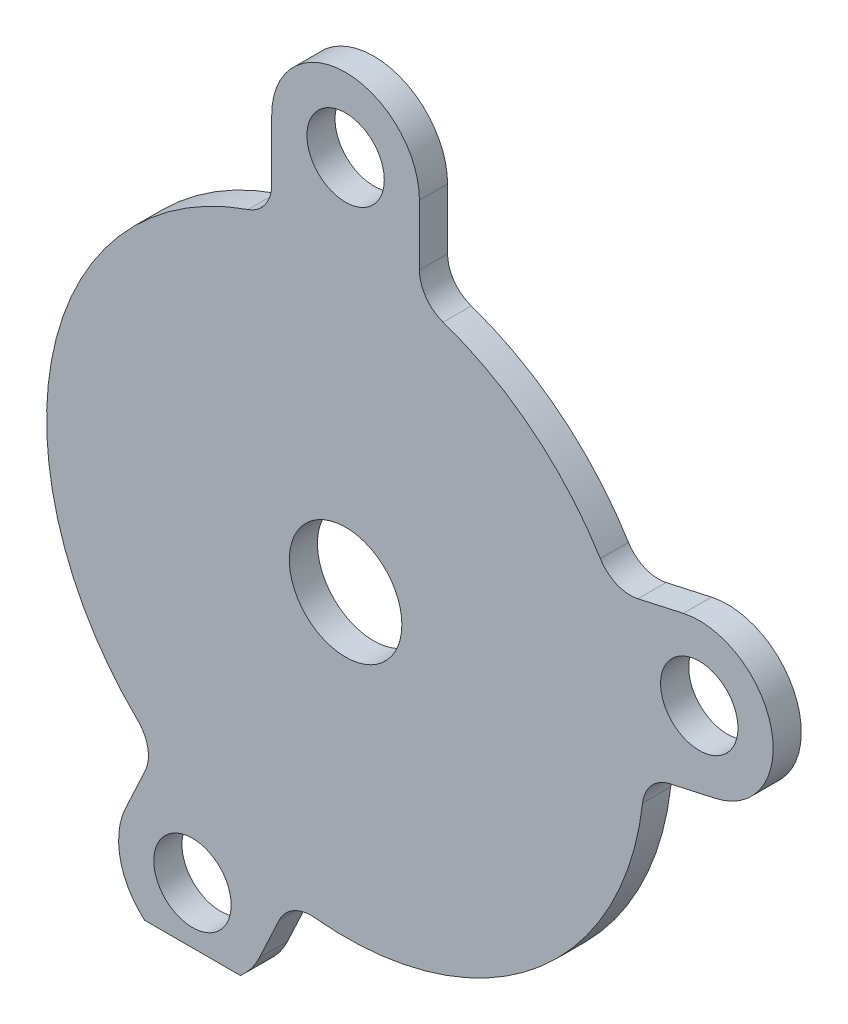
ISO-10303-21;
HEADER;
FILE_DESCRIPTION(('STEP AP214'),'2;1');
FILE_NAME('part.step','',(''),(''),'','','');
FILE_SCHEMA(('AUTOMOTIVE_DESIGN { 1 0 10303 214 1 1 1 1 }'));
ENDSEC;
DATA;
#1=APPLICATION_CONTEXT('core data for automotive mechanical design processes');
#2=APPLICATION_PROTOCOL_DEFINITION('international standard','automotive_design',2000,#1);
#3=PRODUCT_CONTEXT('',#1,'mechanical');
#4=PRODUCT('Part','Part','',(#3));
#5=PRODUCT_RELATED_PRODUCT_CATEGORY('part','',(#4));
#6=PRODUCT_DEFINITION_FORMATION('','',#4);
#7=PRODUCT_DEFINITION_CONTEXT('part definition',#1,'design');
#8=PRODUCT_DEFINITION('design','',#6,#7);
#9=PRODUCT_DEFINITION_SHAPE('','',#8);
#10=(LENGTH_UNIT() NAMED_UNIT(*) SI_UNIT(.MILLI.,.METRE.));
#11=(NAMED_UNIT(*) PLANE_ANGLE_UNIT() SI_UNIT($,.RADIAN.));
#12=(NAMED_UNIT(*) SI_UNIT($,.STERADIAN.) SOLID_ANGLE_UNIT());
#13=UNCERTAINTY_MEASURE_WITH_UNIT(LENGTH_MEASURE(1.E-05),#10,'distance_accuracy_value','');
#14=(GEOMETRIC_REPRESENTATION_CONTEXT(3) GLOBAL_UNCERTAINTY_ASSIGNED_CONTEXT((#13)) GLOBAL_UNIT_ASSIGNED_CONTEXT((#10,
#11,#12)) REPRESENTATION_CONTEXT('',''));
#15=CARTESIAN_POINT('',(0.,0.,0.));
#16=DIRECTION('',(0.,0.,1.));
#17=DIRECTION('',(1.,0.,0.));
#18=AXIS2_PLACEMENT_3D('',#15,#16,#17);
#19=CARTESIAN_POINT('',(47.190396016659,-5.41447354697508,4.));
#20=DIRECTION('',(0.,0.,1.));
#21=DIRECTION('',(1.,0.,0.));
#22=AXIS2_PLACEMENT_3D('',#19,#20,#21);
#23=PLANE('',#22);
#24=CARTESIAN_POINT('',(-21.7648404796457,-46.6748510323876,4.));
#25=DIRECTION('',(0.,0.,1.));
#26=DIRECTION('',(1.,0.,0.));
#27=AXIS2_PLACEMENT_3D('',#24,#25,#26);
#28=CIRCLE('',#27,5.5);
#29=CARTESIAN_POINT('',(-16.2648404796457,-46.6748510323876,4.));
#30=VERTEX_POINT('',#29);
#31=EDGE_CURVE('E394',#30,#30,#28,.T.);
#32=ORIENTED_EDGE('',*,*,#31,.F.);
#33=EDGE_LOOP('',(#32));
#34=FACE_BOUND('',#33,.T.);
#35=CARTESIAN_POINT('',(50.2792443666766,11.1466401178121,4.));
#36=DIRECTION('',(0.,0.,1.));
#37=DIRECTION('',(1.,0.,0.));
#38=AXIS2_PLACEMENT_3D('',#35,#36,#37);
#39=CIRCLE('',#38,5.5);
#40=CARTESIAN_POINT('',(55.7792443666766,11.1466401178121,4.));
#41=VERTEX_POINT('',#40);
#42=EDGE_CURVE('E204',#41,#41,#39,.T.);
#43=ORIENTED_EDGE('',*,*,#42,.F.);
#44=EDGE_LOOP('',(#43));
#45=FACE_BOUND('',#44,.T.);
#46=CARTESIAN_POINT('',(47.190396016659,-5.41447354697508,4.));
#47=DIRECTION('',(0.,0.,-1.));
#48=DIRECTION('',(1.,0.,0.));
#49=AXIS2_PLACEMENT_3D('',#46,#47,#48);
#50=CIRCLE('',#49,5.);
#51=CARTESIAN_POINT('',(42.2229859096423,-4.84452896308298,4.));
#52=VERTEX_POINT('',#51);
#53=CARTESIAN_POINT('',(46.1081979469685,-0.53299351137541,4.));
#54=VERTEX_POINT('',#53);
#55=EDGE_CURVE('E239',#52,#54,#50,.T.);
#56=ORIENTED_EDGE('',*,*,#55,.T.);
#57=DIRECTION('',(0.976296007119934,0.2164396139381,0.));
#58=VECTOR('',#57,1.);
#59=CARTESIAN_POINT('',(46.1081979469685,-0.53299351137541,4.));
#60=LINE('',#59,#58);
#61=CARTESIAN_POINT('',(52.5518603130267,0.895532043052833,4.));
#62=VERTEX_POINT('',#61);
#63=EDGE_CURVE('E127',#54,#62,#60,.T.);
#64=ORIENTED_EDGE('',*,*,#63,.T.);
#65=CARTESIAN_POINT('',(50.2792443666766,11.1466401178121,4.));
#66=DIRECTION('',(0.,0.,1.));
#67=DIRECTION('',(1.,0.,0.));
#68=AXIS2_PLACEMENT_3D('',#65,#66,#67);
#69=CIRCLE('',#68,10.5);
#70=CARTESIAN_POINT('',(48.0066284203265,21.3977481925715,4.));
#71=VERTEX_POINT('',#70);
#72=EDGE_CURVE('E290',#62,#71,#69,.T.);
#73=ORIENTED_EDGE('',*,*,#72,.T.);
#74=DIRECTION('',(-0.976296007119934,-0.216439613938099,0.));
#75=VECTOR('',#74,1.);
#76=CARTESIAN_POINT('',(48.0066284203265,21.3977481925714,4.));
#77=LINE('',#76,#75);
#78=CARTESIAN_POINT('',(41.5629660542684,19.9692226381432,4.));
#79=VERTEX_POINT('',#78);
#80=EDGE_CURVE('E309',#71,#79,#77,.T.);
#81=ORIENTED_EDGE('',*,*,#80,.T.);
#82=CARTESIAN_POINT('',(40.4807679845779,24.8507026737429,4.));
#83=DIRECTION('',(0.,0.,-1.));
#84=DIRECTION('',(-1.,0.,0.));
#85=AXIS2_PLACEMENT_3D('',#82,#83,#84);
#86=CIRCLE('',#85,5.);
#87=CARTESIAN_POINT('',(36.2196345125171,22.2348392344015,4.));
#88=VERTEX_POINT('',#87);
#89=EDGE_CURVE('E306',#79,#88,#86,.T.);
#90=ORIENTED_EDGE('',*,*,#89,.T.);
#91=CARTESIAN_POINT('',(0.,0.,4.));
#92=DIRECTION('',(0.,0.,1.));
#93=DIRECTION('',(1.,0.,0.));
#94=AXIS2_PLACEMENT_3D('',#91,#92,#93);
#95=CIRCLE('',#94,42.5);
#96=CARTESIAN_POINT('',(13.8684210526316,40.1735845737834,4.));
#97=VERTEX_POINT('',#96);
#98=EDGE_CURVE('E308',#88,#97,#95,.T.);
#99=ORIENTED_EDGE('',*,*,#98,.T.);
#100=CARTESIAN_POINT('',(15.5,44.8998886412873,4.));
#101=DIRECTION('',(0.,0.,-1.));
#102=DIRECTION('',(1.,0.,0.));
#103=AXIS2_PLACEMENT_3D('',#100,#101,#102);
#104=CIRCLE('',#103,5.);
#105=CARTESIAN_POINT('',(10.5,44.8998886412873,4.));
#106=VERTEX_POINT('',#105);
#107=EDGE_CURVE('E311',#97,#106,#104,.T.);
#108=ORIENTED_EDGE('',*,*,#107,.T.);
#109=DIRECTION('',(0.,1.,0.));
#110=VECTOR('',#109,1.);
#111=CARTESIAN_POINT('',(10.5,53.5,4.));
#112=LINE('',#111,#110);
#113=CARTESIAN_POINT('',(10.5,53.5,4.));
#114=VERTEX_POINT('',#113);
#115=EDGE_CURVE('E317',#106,#114,#112,.T.);
#116=ORIENTED_EDGE('',*,*,#115,.T.);
#117=CARTESIAN_POINT('',(0.,53.5,4.));
#118=DIRECTION('',(0.,0.,1.));
#119=DIRECTION('',(1.,0.,0.));
#120=AXIS2_PLACEMENT_3D('',#117,#118,#119);
#121=CIRCLE('',#120,10.5);
#122=CARTESIAN_POINT('',(-10.5,53.5,4.));
#123=VERTEX_POINT('',#122);
#124=EDGE_CURVE('E319',#114,#123,#121,.T.);
#125=ORIENTED_EDGE('',*,*,#124,.T.);
#126=DIRECTION('',(0.,-1.,0.));
#127=VECTOR('',#126,1.);
#128=CARTESIAN_POINT('',(-10.5,53.5,4.));
#129=LINE('',#128,#127);
#130=CARTESIAN_POINT('',(-10.5,44.8998886412873,4.));
#131=VERTEX_POINT('',#130);
#132=EDGE_CURVE('E321',#123,#131,#129,.T.);
#133=ORIENTED_EDGE('',*,*,#132,.T.);
#134=CARTESIAN_POINT('',(-15.5,44.8998886412873,4.));
#135=DIRECTION('',(0.,0.,-1.));
#136=DIRECTION('',(-1.,0.,0.));
#137=AXIS2_PLACEMENT_3D('',#134,#135,#136);
#138=CIRCLE('',#137,5.);
#139=CARTESIAN_POINT('',(-13.8684210526316,40.1735845737834,4.));
#140=VERTEX_POINT('',#139);
#141=EDGE_CURVE('E323',#131,#140,#138,.T.);
#142=ORIENTED_EDGE('',*,*,#141,.T.);
#143=CARTESIAN_POINT('',(0.,0.,4.));
#144=DIRECTION('',(0.,0.,1.));
#145=DIRECTION('',(1.,0.,0.));
#146=AXIS2_PLACEMENT_3D('',#143,#144,#145);
#147=CIRCLE('',#146,42.5);
#148=CARTESIAN_POINT('',(-29.5471484743681,-30.5485845340442,4.));
#149=VERTEX_POINT('',#148);
#150=EDGE_CURVE('E325',#140,#149,#147,.T.);
#151=ORIENTED_EDGE('',*,*,#150,.T.);
#152=CARTESIAN_POINT('',(-33.0232835889997,-34.1425356556965,4.));
#153=DIRECTION('',(0.,0.,-1.));
#154=DIRECTION('',(1.,0.,0.));
#155=AXIS2_PLACEMENT_3D('',#152,#153,#154);
#156=CIRCLE('',#155,5.00000000000001);
#157=CARTESIAN_POINT('',(-28.4917446538164,-36.2556269643999,4.));
#158=VERTEX_POINT('',#157);
#159=EDGE_CURVE('E327',#149,#158,#156,.T.);
#160=ORIENTED_EDGE('',*,*,#159,.T.);
#161=DIRECTION('',(-0.422618261740694,-0.906307787036653,0.));
#162=VECTOR('',#161,1.);
#163=CARTESIAN_POINT('',(-31.2810722435306,-42.2373592841103,4.));
#164=LINE('',#163,#162);
#165=CARTESIAN_POINT('',(-31.2810722435306,-42.2373592841103,4.));
#166=VERTEX_POINT('',#165);
#167=EDGE_CURVE('E329',#158,#166,#164,.T.);
#168=ORIENTED_EDGE('',*,*,#167,.T.);
#169=CARTESIAN_POINT('',(-21.7648404796457,-46.6748510323876,4.));
#170=DIRECTION('',(0.,0.,1.));
#171=DIRECTION('',(1.,0.,0.));
#172=AXIS2_PLACEMENT_3D('',#169,#170,#171);
#173=CIRCLE('',#172,10.5);
#174=CARTESIAN_POINT('',(-28.5655757340134,-54.6748510323876,4.));
#175=VERTEX_POINT('',#174);
#176=EDGE_CURVE('E331',#166,#175,#173,.T.);
#177=ORIENTED_EDGE('',*,*,#176,.T.);
#178=DIRECTION('',(1.,0.,0.));
#179=VECTOR('',#178,1.);
#180=CARTESIAN_POINT('',(-28.5655757340134,-54.6748510323876,4.));
#181=LINE('',#180,#179);
#182=CARTESIAN_POINT('',(-14.964105225278,-54.6748510323876,4.));
#183=VERTEX_POINT('',#182);
#184=EDGE_CURVE('E333',#175,#183,#181,.T.);
#185=ORIENTED_EDGE('',*,*,#184,.T.);
#186=CARTESIAN_POINT('',(-21.7648404796457,-46.6748510323876,4.));
#187=DIRECTION('',(0.,0.,1.));
#188=DIRECTION('',(1.,0.,0.));
#189=AXIS2_PLACEMENT_3D('',#186,#187,#188);
#190=CIRCLE('',#189,10.5);
#191=CARTESIAN_POINT('',(-12.2486087157609,-51.1123427806649,4.));
#192=VERTEX_POINT('',#191);
#193=EDGE_CURVE('E182',#183,#192,#190,.T.);
#194=ORIENTED_EDGE('',*,*,#193,.T.);
#195=DIRECTION('',(0.422618261740694,0.906307787036653,0.));
#196=VECTOR('',#195,1.);
#197=CARTESIAN_POINT('',(-12.2486087157609,-51.1123427806649,4.));
#198=LINE('',#197,#196);
#199=CARTESIAN_POINT('',(-9.45928112604669,-45.1306104609545,4.));
#200=VERTEX_POINT('',#199);
#201=EDGE_CURVE('E176',#192,#200,#198,.T.);
#202=ORIENTED_EDGE('',*,*,#201,.T.);
#203=CARTESIAN_POINT('',(-4.92774219086344,-47.243701769658,4.));
#204=DIRECTION('',(0.,0.,-1.));
#205=DIRECTION('',(-1.,0.,0.));
#206=AXIS2_PLACEMENT_3D('',#203,#204,#205);
#207=CIRCLE('',#206,5.);
#208=CARTESIAN_POINT('',(-4.40903248656202,-42.2706805307466,4.));
#209=VERTEX_POINT('',#208);
#210=EDGE_CURVE('E180',#200,#209,#207,.T.);
#211=ORIENTED_EDGE('',*,*,#210,.T.);
#212=CARTESIAN_POINT('',(0.,0.,4.));
#213=DIRECTION('',(0.,0.,1.));
#214=DIRECTION('',(1.,0.,0.));
#215=AXIS2_PLACEMENT_3D('',#212,#213,#214);
#216=CIRCLE('',#215,42.5);
#217=EDGE_CURVE('E48',#209,#52,#216,.T.);
#218=ORIENTED_EDGE('',*,*,#217,.T.);
#219=EDGE_LOOP('',(#56,#64,#73,#81,#90,#99,#108,#116,#125,#133,#142,#151,#160,#168,#177,#185,
#194,#202,#211,#218));
#220=FACE_BOUND('',#219,.T.);
#221=CARTESIAN_POINT('',(0.,53.5,4.));
#222=DIRECTION('',(0.,0.,1.));
#223=DIRECTION('',(1.,0.,0.));
#224=AXIS2_PLACEMENT_3D('',#221,#222,#223);
#225=CIRCLE('',#224,5.5);
#226=CARTESIAN_POINT('',(5.5,53.5,4.));
#227=VERTEX_POINT('',#226);
#228=EDGE_CURVE('E400',#227,#227,#225,.T.);
#229=ORIENTED_EDGE('',*,*,#228,.F.);
#230=EDGE_LOOP('',(#229));
#231=FACE_BOUND('',#230,.T.);
#232=CARTESIAN_POINT('',(0.,0.,4.));
#233=DIRECTION('',(0.,0.,1.));
#234=DIRECTION('',(1.,0.,0.));
#235=AXIS2_PLACEMENT_3D('',#232,#233,#234);
#236=CIRCLE('',#235,8.);
#237=CARTESIAN_POINT('',(8.,0.,4.));
#238=VERTEX_POINT('',#237);
#239=EDGE_CURVE('E385',#238,#238,#236,.T.);
#240=ORIENTED_EDGE('',*,*,#239,.F.);
#241=EDGE_LOOP('',(#240));
#242=FACE_BOUND('',#241,.T.);
#243=ADVANCED_FACE('F31',(#34,#45,#220,#231,#242),#23,.T.);
#244=CARTESIAN_POINT('',(47.190396016659,-5.41447354697508,0.));
#245=DIRECTION('',(0.,0.,1.));
#246=DIRECTION('',(1.,0.,0.));
#247=AXIS2_PLACEMENT_3D('',#244,#245,#246);
#248=PLANE('',#247);
#249=CARTESIAN_POINT('',(-21.7648404796457,-46.6748510323876,0.));
#250=DIRECTION('',(0.,0.,1.));
#251=DIRECTION('',(1.,0.,0.));
#252=AXIS2_PLACEMENT_3D('',#249,#250,#251);
#253=CIRCLE('',#252,5.5);
#254=CARTESIAN_POINT('',(-16.2648404796457,-46.6748510323876,0.));
#255=VERTEX_POINT('',#254);
#256=EDGE_CURVE('E391',#255,#255,#253,.T.);
#257=ORIENTED_EDGE('',*,*,#256,.T.);
#258=EDGE_LOOP('',(#257));
#259=FACE_BOUND('',#258,.T.);
#260=CARTESIAN_POINT('',(50.2792443666766,11.1466401178121,0.));
#261=DIRECTION('',(0.,0.,1.));
#262=DIRECTION('',(1.,0.,0.));
#263=AXIS2_PLACEMENT_3D('',#260,#261,#262);
#264=CIRCLE('',#263,5.5);
#265=CARTESIAN_POINT('',(55.7792443666766,11.1466401178121,0.));
#266=VERTEX_POINT('',#265);
#267=EDGE_CURVE('E403',#266,#266,#264,.T.);
#268=ORIENTED_EDGE('',*,*,#267,.T.);
#269=EDGE_LOOP('',(#268));
#270=FACE_BOUND('',#269,.T.);
#271=CARTESIAN_POINT('',(47.190396016659,-5.41447354697508,0.));
#272=DIRECTION('',(0.,0.,-1.));
#273=DIRECTION('',(1.,0.,0.));
#274=AXIS2_PLACEMENT_3D('',#271,#272,#273);
#275=CIRCLE('',#274,5.);
#276=CARTESIAN_POINT('',(42.2229859096423,-4.84452896308298,0.));
#277=VERTEX_POINT('',#276);
#278=CARTESIAN_POINT('',(46.1081979469685,-0.53299351137541,0.));
#279=VERTEX_POINT('',#278);
#280=EDGE_CURVE('E200',#277,#279,#275,.T.);
#281=ORIENTED_EDGE('',*,*,#280,.F.);
#282=CARTESIAN_POINT('',(0.,0.,0.));
#283=DIRECTION('',(0.,0.,1.));
#284=DIRECTION('',(1.,0.,0.));
#285=AXIS2_PLACEMENT_3D('',#282,#283,#284);
#286=CIRCLE('',#285,42.5);
#287=CARTESIAN_POINT('',(-4.40903248656202,-42.2706805307466,0.));
#288=VERTEX_POINT('',#287);
#289=EDGE_CURVE('E119',#288,#277,#286,.T.);
#290=ORIENTED_EDGE('',*,*,#289,.F.);
#291=CARTESIAN_POINT('',(-4.92774219086344,-47.243701769658,0.));
#292=DIRECTION('',(0.,0.,-1.));
#293=DIRECTION('',(-1.,0.,0.));
#294=AXIS2_PLACEMENT_3D('',#291,#292,#293);
#295=CIRCLE('',#294,5.);
#296=CARTESIAN_POINT('',(-9.45928112604669,-45.1306104609545,0.));
#297=VERTEX_POINT('',#296);
#298=EDGE_CURVE('E113',#297,#288,#295,.T.);
#299=ORIENTED_EDGE('',*,*,#298,.F.);
#300=DIRECTION('',(0.422618261740694,0.906307787036653,0.));
#301=VECTOR('',#300,1.);
#302=CARTESIAN_POINT('',(-12.2486087157609,-51.1123427806649,0.));
#303=LINE('',#302,#301);
#304=CARTESIAN_POINT('',(-12.2486087157609,-51.1123427806649,0.));
#305=VERTEX_POINT('',#304);
#306=EDGE_CURVE('E190',#305,#297,#303,.T.);
#307=ORIENTED_EDGE('',*,*,#306,.F.);
#308=CARTESIAN_POINT('',(-21.7648404796457,-46.6748510323876,0.));
#309=DIRECTION('',(0.,0.,1.));
#310=DIRECTION('',(1.,0.,0.));
#311=AXIS2_PLACEMENT_3D('',#308,#309,#310);
#312=CIRCLE('',#311,10.5);
#313=CARTESIAN_POINT('',(-14.964105225278,-54.6748510323876,0.));
#314=VERTEX_POINT('',#313);
#315=EDGE_CURVE('E234',#314,#305,#312,.T.);
#316=ORIENTED_EDGE('',*,*,#315,.F.);
#317=DIRECTION('',(1.,0.,0.));
#318=VECTOR('',#317,1.);
#319=CARTESIAN_POINT('',(-28.5655757340134,-54.6748510323876,0.));
#320=LINE('',#319,#318);
#321=CARTESIAN_POINT('',(-28.5655757340134,-54.6748510323876,0.));
#322=VERTEX_POINT('',#321);
#323=EDGE_CURVE('E232',#322,#314,#320,.T.);
#324=ORIENTED_EDGE('',*,*,#323,.F.);
#325=CARTESIAN_POINT('',(-21.7648404796457,-46.6748510323876,0.));
#326=DIRECTION('',(0.,0.,1.));
#327=DIRECTION('',(1.,0.,0.));
#328=AXIS2_PLACEMENT_3D('',#325,#326,#327);
#329=CIRCLE('',#328,10.5);
#330=CARTESIAN_POINT('',(-31.2810722435306,-42.2373592841103,0.));
#331=VERTEX_POINT('',#330);
#332=EDGE_CURVE('E230',#331,#322,#329,.T.);
#333=ORIENTED_EDGE('',*,*,#332,.F.);
#334=DIRECTION('',(-0.422618261740694,-0.906307787036653,0.));
#335=VECTOR('',#334,1.);
#336=CARTESIAN_POINT('',(-31.2810722435306,-42.2373592841103,0.));
#337=LINE('',#336,#335);
#338=CARTESIAN_POINT('',(-28.4917446538164,-36.2556269643999,0.));
#339=VERTEX_POINT('',#338);
#340=EDGE_CURVE('E228',#339,#331,#337,.T.);
#341=ORIENTED_EDGE('',*,*,#340,.F.);
#342=CARTESIAN_POINT('',(-33.0232835889997,-34.1425356556965,0.));
#343=DIRECTION('',(0.,0.,-1.));
#344=DIRECTION('',(1.,0.,0.));
#345=AXIS2_PLACEMENT_3D('',#342,#343,#344);
#346=CIRCLE('',#345,5.00000000000001);
#347=CARTESIAN_POINT('',(-29.5471484743681,-30.5485845340442,0.));
#348=VERTEX_POINT('',#347);
#349=EDGE_CURVE('E226',#348,#339,#346,.T.);
#350=ORIENTED_EDGE('',*,*,#349,.F.);
#351=CARTESIAN_POINT('',(0.,0.,0.));
#352=DIRECTION('',(0.,0.,1.));
#353=DIRECTION('',(1.,0.,0.));
#354=AXIS2_PLACEMENT_3D('',#351,#352,#353);
#355=CIRCLE('',#354,42.5);
#356=CARTESIAN_POINT('',(-13.8684210526316,40.1735845737834,0.));
#357=VERTEX_POINT('',#356);
#358=EDGE_CURVE('E224',#357,#348,#355,.T.);
#359=ORIENTED_EDGE('',*,*,#358,.F.);
#360=CARTESIAN_POINT('',(-15.5,44.8998886412873,0.));
#361=DIRECTION('',(0.,0.,-1.));
#362=DIRECTION('',(-1.,0.,0.));
#363=AXIS2_PLACEMENT_3D('',#360,#361,#362);
#364=CIRCLE('',#363,5.);
#365=CARTESIAN_POINT('',(-10.5,44.8998886412873,0.));
#366=VERTEX_POINT('',#365);
#367=EDGE_CURVE('E222',#366,#357,#364,.T.);
#368=ORIENTED_EDGE('',*,*,#367,.F.);
#369=DIRECTION('',(0.,-1.,0.));
#370=VECTOR('',#369,1.);
#371=CARTESIAN_POINT('',(-10.5,53.5,0.));
#372=LINE('',#371,#370);
#373=CARTESIAN_POINT('',(-10.5,53.5,0.));
#374=VERTEX_POINT('',#373);
#375=EDGE_CURVE('E220',#374,#366,#372,.T.);
#376=ORIENTED_EDGE('',*,*,#375,.F.);
#377=CARTESIAN_POINT('',(0.,53.5,0.));
#378=DIRECTION('',(0.,0.,1.));
#379=DIRECTION('',(1.,0.,0.));
#380=AXIS2_PLACEMENT_3D('',#377,#378,#379);
#381=CIRCLE('',#380,10.5);
#382=CARTESIAN_POINT('',(10.5,53.5,0.));
#383=VERTEX_POINT('',#382);
#384=EDGE_CURVE('E218',#383,#374,#381,.T.);
#385=ORIENTED_EDGE('',*,*,#384,.F.);
#386=DIRECTION('',(0.,1.,0.));
#387=VECTOR('',#386,1.);
#388=CARTESIAN_POINT('',(10.5,53.5,0.));
#389=LINE('',#388,#387);
#390=CARTESIAN_POINT('',(10.5,44.8998886412873,0.));
#391=VERTEX_POINT('',#390);
#392=EDGE_CURVE('E216',#391,#383,#389,.T.);
#393=ORIENTED_EDGE('',*,*,#392,.F.);
#394=CARTESIAN_POINT('',(15.5,44.8998886412873,0.));
#395=DIRECTION('',(0.,0.,-1.));
#396=DIRECTION('',(1.,0.,0.));
#397=AXIS2_PLACEMENT_3D('',#394,#395,#396);
#398=CIRCLE('',#397,5.);
#399=CARTESIAN_POINT('',(13.8684210526316,40.1735845737834,0.));
#400=VERTEX_POINT('',#399);
#401=EDGE_CURVE('E214',#400,#391,#398,.T.);
#402=ORIENTED_EDGE('',*,*,#401,.F.);
#403=CARTESIAN_POINT('',(0.,0.,0.));
#404=DIRECTION('',(0.,0.,1.));
#405=DIRECTION('',(1.,0.,0.));
#406=AXIS2_PLACEMENT_3D('',#403,#404,#405);
#407=CIRCLE('',#406,42.5);
#408=CARTESIAN_POINT('',(36.2196345125171,22.2348392344015,0.));
#409=VERTEX_POINT('',#408);
#410=EDGE_CURVE('E212',#409,#400,#407,.T.);
#411=ORIENTED_EDGE('',*,*,#410,.F.);
#412=CARTESIAN_POINT('',(40.4807679845779,24.8507026737429,0.));
#413=DIRECTION('',(0.,0.,-1.));
#414=DIRECTION('',(-1.,0.,0.));
#415=AXIS2_PLACEMENT_3D('',#412,#413,#414);
#416=CIRCLE('',#415,5.);
#417=CARTESIAN_POINT('',(41.5629660542684,19.9692226381432,0.));
#418=VERTEX_POINT('',#417);
#419=EDGE_CURVE('E210',#418,#409,#416,.T.);
#420=ORIENTED_EDGE('',*,*,#419,.F.);
#421=DIRECTION('',(-0.976296007119934,-0.216439613938099,0.));
#422=VECTOR('',#421,1.);
#423=CARTESIAN_POINT('',(48.0066284203265,21.3977481925714,0.));
#424=LINE('',#423,#422);
#425=CARTESIAN_POINT('',(48.0066284203265,21.3977481925715,0.));
#426=VERTEX_POINT('',#425);
#427=EDGE_CURVE('E208',#426,#418,#424,.T.);
#428=ORIENTED_EDGE('',*,*,#427,.F.);
#429=CARTESIAN_POINT('',(50.2792443666766,11.1466401178121,0.));
#430=DIRECTION('',(0.,0.,1.));
#431=DIRECTION('',(1.,0.,0.));
#432=AXIS2_PLACEMENT_3D('',#429,#430,#431);
#433=CIRCLE('',#432,10.5);
#434=CARTESIAN_POINT('',(52.5518603130267,0.895532043052833,0.));
#435=VERTEX_POINT('',#434);
#436=EDGE_CURVE('E206',#435,#426,#433,.T.);
#437=ORIENTED_EDGE('',*,*,#436,.F.);
#438=DIRECTION('',(0.976296007119934,0.2164396139381,0.));
#439=VECTOR('',#438,1.);
#440=CARTESIAN_POINT('',(46.1081979469685,-0.53299351137541,0.));
#441=LINE('',#440,#439);
#442=EDGE_CURVE('E203',#279,#435,#441,.T.);
#443=ORIENTED_EDGE('',*,*,#442,.F.);
#444=EDGE_LOOP('',(#281,#290,#299,#307,#316,#324,#333,#341,#350,#359,#368,#376,#385,#393,#402,
#411,#420,#428,#437,#443));
#445=FACE_BOUND('',#444,.T.);
#446=CARTESIAN_POINT('',(0.,53.5,0.));
#447=DIRECTION('',(0.,0.,1.));
#448=DIRECTION('',(1.,0.,0.));
#449=AXIS2_PLACEMENT_3D('',#446,#447,#448);
#450=CIRCLE('',#449,5.5);
#451=CARTESIAN_POINT('',(5.5,53.5,0.));
#452=VERTEX_POINT('',#451);
#453=EDGE_CURVE('E397',#452,#452,#450,.T.);
#454=ORIENTED_EDGE('',*,*,#453,.T.);
#455=EDGE_LOOP('',(#454));
#456=FACE_BOUND('',#455,.T.);
#457=CARTESIAN_POINT('',(0.,0.,0.));
#458=DIRECTION('',(0.,0.,1.));
#459=DIRECTION('',(1.,0.,0.));
#460=AXIS2_PLACEMENT_3D('',#457,#458,#459);
#461=CIRCLE('',#460,8.);
#462=CARTESIAN_POINT('',(8.,0.,0.));
#463=VERTEX_POINT('',#462);
#464=EDGE_CURVE('E388',#463,#463,#461,.T.);
#465=ORIENTED_EDGE('',*,*,#464,.T.);
#466=EDGE_LOOP('',(#465));
#467=FACE_BOUND('',#466,.T.);
#468=ADVANCED_FACE('F294',(#259,#270,#445,#456,#467),#248,.F.);
#469=CARTESIAN_POINT('',(47.190396016659,-5.41447354697508,4.));
#470=DIRECTION('',(0.,0.,-1.));
#471=DIRECTION('',(-1.,0.,0.));
#472=AXIS2_PLACEMENT_3D('',#469,#470,#471);
#473=CYLINDRICAL_SURFACE('',#472,5.);
#474=ORIENTED_EDGE('',*,*,#280,.T.);
#475=DIRECTION('',(0.,0.,-1.));
#476=VECTOR('',#475,1.);
#477=CARTESIAN_POINT('',(46.1081979469685,-0.53299351137541,4.));
#478=LINE('',#477,#476);
#479=EDGE_CURVE('E11',#54,#279,#478,.T.);
#480=ORIENTED_EDGE('',*,*,#479,.F.);
#481=ORIENTED_EDGE('',*,*,#55,.F.);
#482=DIRECTION('',(0.,0.,-1.));
#483=VECTOR('',#482,1.);
#484=CARTESIAN_POINT('',(42.2229859096423,-4.84452896308298,4.));
#485=LINE('',#484,#483);
#486=EDGE_CURVE('E196',#52,#277,#485,.T.);
#487=ORIENTED_EDGE('',*,*,#486,.T.);
#488=EDGE_LOOP('',(#474,#480,#481,#487));
#489=FACE_BOUND('',#488,.T.);
#490=ADVANCED_FACE('F33',(#489),#473,.F.);
#491=CARTESIAN_POINT('',(46.1081979469685,-0.53299351137541,4.));
#492=DIRECTION('',(-0.2164396139381,0.976296007119934,0.));
#493=DIRECTION('',(-0.976296007119934,-0.2164396139381,0.));
#494=AXIS2_PLACEMENT_3D('',#491,#492,#493);
#495=PLANE('',#494);
#496=ORIENTED_EDGE('',*,*,#442,.T.);
#497=DIRECTION('',(0.,0.,-1.));
#498=VECTOR('',#497,1.);
#499=CARTESIAN_POINT('',(52.5518603130267,0.895532043052833,4.));
#500=LINE('',#499,#498);
#501=EDGE_CURVE('E40',#62,#435,#500,.T.);
#502=ORIENTED_EDGE('',*,*,#501,.F.);
#503=ORIENTED_EDGE('',*,*,#63,.F.);
#504=ORIENTED_EDGE('',*,*,#479,.T.);
#505=EDGE_LOOP('',(#496,#502,#503,#504));
#506=FACE_BOUND('',#505,.T.);
#507=ADVANCED_FACE('F592',(#506),#495,.F.);
#508=CARTESIAN_POINT('',(50.2792443666766,11.1466401178121,4.));
#509=DIRECTION('',(0.,0.,-1.));
#510=DIRECTION('',(-1.,0.,0.));
#511=AXIS2_PLACEMENT_3D('',#508,#509,#510);
#512=CYLINDRICAL_SURFACE('',#511,10.5);
#513=ORIENTED_EDGE('',*,*,#436,.T.);
#514=DIRECTION('',(0.,0.,-1.));
#515=VECTOR('',#514,1.);
#516=CARTESIAN_POINT('',(48.0066284203265,21.3977481925715,4.));
#517=LINE('',#516,#515);
#518=EDGE_CURVE('E282',#71,#426,#517,.T.);
#519=ORIENTED_EDGE('',*,*,#518,.F.);
#520=ORIENTED_EDGE('',*,*,#72,.F.);
#521=ORIENTED_EDGE('',*,*,#501,.T.);
#522=EDGE_LOOP('',(#513,#519,#520,#521));
#523=FACE_BOUND('',#522,.T.);
#524=ADVANCED_FACE('F288',(#523),#512,.T.);
#525=CARTESIAN_POINT('',(48.0066284203265,21.3977481925714,4.));
#526=DIRECTION('',(0.216439613938099,-0.976296007119934,0.));
#527=DIRECTION('',(0.976296007119934,0.216439613938099,0.));
#528=AXIS2_PLACEMENT_3D('',#525,#526,#527);
#529=PLANE('',#528);
#530=ORIENTED_EDGE('',*,*,#427,.T.);
#531=DIRECTION('',(0.,0.,-1.));
#532=VECTOR('',#531,1.);
#533=CARTESIAN_POINT('',(41.5629660542684,19.9692226381432,4.));
#534=LINE('',#533,#532);
#535=EDGE_CURVE('E279',#79,#418,#534,.T.);
#536=ORIENTED_EDGE('',*,*,#535,.F.);
#537=ORIENTED_EDGE('',*,*,#80,.F.);
#538=ORIENTED_EDGE('',*,*,#518,.T.);
#539=EDGE_LOOP('',(#530,#536,#537,#538));
#540=FACE_BOUND('',#539,.T.);
#541=ADVANCED_FACE('F300',(#540),#529,.F.);
#542=CARTESIAN_POINT('',(40.4807679845779,24.8507026737429,4.));
#543=DIRECTION('',(0.,0.,-1.));
#544=DIRECTION('',(-1.,0.,0.));
#545=AXIS2_PLACEMENT_3D('',#542,#543,#544);
#546=CYLINDRICAL_SURFACE('',#545,5.);
#547=ORIENTED_EDGE('',*,*,#419,.T.);
#548=DIRECTION('',(0.,0.,-1.));
#549=VECTOR('',#548,1.);
#550=CARTESIAN_POINT('',(36.2196345125171,22.2348392344015,4.));
#551=LINE('',#550,#549);
#552=EDGE_CURVE('E276',#88,#409,#551,.T.);
#553=ORIENTED_EDGE('',*,*,#552,.F.);
#554=ORIENTED_EDGE('',*,*,#89,.F.);
#555=ORIENTED_EDGE('',*,*,#535,.T.);
#556=EDGE_LOOP('',(#547,#553,#554,#555));
#557=FACE_BOUND('',#556,.T.);
#558=ADVANCED_FACE('F304',(#557),#546,.F.);
#559=CARTESIAN_POINT('',(0.,0.,4.));
#560=DIRECTION('',(0.,0.,-1.));
#561=DIRECTION('',(-1.,0.,0.));
#562=AXIS2_PLACEMENT_3D('',#559,#560,#561);
#563=CYLINDRICAL_SURFACE('',#562,42.5);
#564=ORIENTED_EDGE('',*,*,#410,.T.);
#565=DIRECTION('',(0.,0.,-1.));
#566=VECTOR('',#565,1.);
#567=CARTESIAN_POINT('',(13.8684210526316,40.1735845737834,4.));
#568=LINE('',#567,#566);
#569=EDGE_CURVE('E273',#97,#400,#568,.T.);
#570=ORIENTED_EDGE('',*,*,#569,.F.);
#571=ORIENTED_EDGE('',*,*,#98,.F.);
#572=ORIENTED_EDGE('',*,*,#552,.T.);
#573=EDGE_LOOP('',(#564,#570,#571,#572));
#574=FACE_BOUND('',#573,.T.);
#575=ADVANCED_FACE('F557',(#574),#563,.T.);
#576=CARTESIAN_POINT('',(15.5,44.8998886412873,4.));
#577=DIRECTION('',(0.,0.,-1.));
#578=DIRECTION('',(-1.,0.,0.));
#579=AXIS2_PLACEMENT_3D('',#576,#577,#578);
#580=CYLINDRICAL_SURFACE('',#579,5.);
#581=ORIENTED_EDGE('',*,*,#401,.T.);
#582=DIRECTION('',(0.,0.,-1.));
#583=VECTOR('',#582,1.);
#584=CARTESIAN_POINT('',(10.5,44.8998886412873,4.));
#585=LINE('',#584,#583);
#586=EDGE_CURVE('E270',#106,#391,#585,.T.);
#587=ORIENTED_EDGE('',*,*,#586,.F.);
#588=ORIENTED_EDGE('',*,*,#107,.F.);
#589=ORIENTED_EDGE('',*,*,#569,.T.);
#590=EDGE_LOOP('',(#581,#587,#588,#589));
#591=FACE_BOUND('',#590,.T.);
#592=ADVANCED_FACE('F547',(#591),#580,.F.);
#593=CARTESIAN_POINT('',(10.5,53.5,4.));
#594=DIRECTION('',(-1.,0.,0.));
#595=DIRECTION('',(0.,0.,1.));
#596=AXIS2_PLACEMENT_3D('',#593,#594,#595);
#597=PLANE('',#596);
#598=ORIENTED_EDGE('',*,*,#392,.T.);
#599=DIRECTION('',(0.,0.,-1.));
#600=VECTOR('',#599,1.);
#601=CARTESIAN_POINT('',(10.5,53.5,4.));
#602=LINE('',#601,#600);
#603=EDGE_CURVE('E267',#114,#383,#602,.T.);
#604=ORIENTED_EDGE('',*,*,#603,.F.);
#605=ORIENTED_EDGE('',*,*,#115,.F.);
#606=ORIENTED_EDGE('',*,*,#586,.T.);
#607=EDGE_LOOP('',(#598,#604,#605,#606));
#608=FACE_BOUND('',#607,.T.);
#609=ADVANCED_FACE('F537',(#608),#597,.F.);
#610=CARTESIAN_POINT('',(0.,53.5,4.));
#611=DIRECTION('',(0.,0.,-1.));
#612=DIRECTION('',(-1.,0.,0.));
#613=AXIS2_PLACEMENT_3D('',#610,#611,#612);
#614=CYLINDRICAL_SURFACE('',#613,10.5);
#615=ORIENTED_EDGE('',*,*,#384,.T.);
#616=DIRECTION('',(0.,0.,-1.));
#617=VECTOR('',#616,1.);
#618=CARTESIAN_POINT('',(-10.5,53.5,4.));
#619=LINE('',#618,#617);
#620=EDGE_CURVE('E264',#123,#374,#619,.T.);
#621=ORIENTED_EDGE('',*,*,#620,.F.);
#622=ORIENTED_EDGE('',*,*,#124,.F.);
#623=ORIENTED_EDGE('',*,*,#603,.T.);
#624=EDGE_LOOP('',(#615,#621,#622,#623));
#625=FACE_BOUND('',#624,.T.);
#626=ADVANCED_FACE('F527',(#625),#614,.T.);
#627=CARTESIAN_POINT('',(-10.5,53.5,4.));
#628=DIRECTION('',(1.,0.,0.));
#629=DIRECTION('',(0.,0.,-1.));
#630=AXIS2_PLACEMENT_3D('',#627,#628,#629);
#631=PLANE('',#630);
#632=ORIENTED_EDGE('',*,*,#375,.T.);
#633=DIRECTION('',(0.,0.,-1.));
#634=VECTOR('',#633,1.);
#635=CARTESIAN_POINT('',(-10.5,44.8998886412873,4.));
#636=LINE('',#635,#634);
#637=EDGE_CURVE('E261',#131,#366,#636,.T.);
#638=ORIENTED_EDGE('',*,*,#637,.F.);
#639=ORIENTED_EDGE('',*,*,#132,.F.);
#640=ORIENTED_EDGE('',*,*,#620,.T.);
#641=EDGE_LOOP('',(#632,#638,#639,#640));
#642=FACE_BOUND('',#641,.T.);
#643=ADVANCED_FACE('F517',(#642),#631,.F.);
#644=CARTESIAN_POINT('',(-15.5,44.8998886412873,4.));
#645=DIRECTION('',(0.,0.,-1.));
#646=DIRECTION('',(-1.,0.,0.));
#647=AXIS2_PLACEMENT_3D('',#644,#645,#646);
#648=CYLINDRICAL_SURFACE('',#647,5.);
#649=ORIENTED_EDGE('',*,*,#367,.T.);
#650=DIRECTION('',(0.,0.,-1.));
#651=VECTOR('',#650,1.);
#652=CARTESIAN_POINT('',(-13.8684210526316,40.1735845737834,4.));
#653=LINE('',#652,#651);
#654=EDGE_CURVE('E258',#140,#357,#653,.T.);
#655=ORIENTED_EDGE('',*,*,#654,.F.);
#656=ORIENTED_EDGE('',*,*,#141,.F.);
#657=ORIENTED_EDGE('',*,*,#637,.T.);
#658=EDGE_LOOP('',(#649,#655,#656,#657));
#659=FACE_BOUND('',#658,.T.);
#660=ADVANCED_FACE('F507',(#659),#648,.F.);
#661=CARTESIAN_POINT('',(0.,0.,4.));
#662=DIRECTION('',(0.,0.,-1.));
#663=DIRECTION('',(-1.,0.,0.));
#664=AXIS2_PLACEMENT_3D('',#661,#662,#663);
#665=CYLINDRICAL_SURFACE('',#664,42.5);
#666=ORIENTED_EDGE('',*,*,#358,.T.);
#667=DIRECTION('',(0.,0.,-1.));
#668=VECTOR('',#667,1.);
#669=CARTESIAN_POINT('',(-29.5471484743681,-30.5485845340442,4.));
#670=LINE('',#669,#668);
#671=EDGE_CURVE('E255',#149,#348,#670,.T.);
#672=ORIENTED_EDGE('',*,*,#671,.F.);
#673=ORIENTED_EDGE('',*,*,#150,.F.);
#674=ORIENTED_EDGE('',*,*,#654,.T.);
#675=EDGE_LOOP('',(#666,#672,#673,#674));
#676=FACE_BOUND('',#675,.T.);
#677=ADVANCED_FACE('F497',(#676),#665,.T.);
#678=CARTESIAN_POINT('',(-33.0232835889997,-34.1425356556965,4.));
#679=DIRECTION('',(0.,0.,-1.));
#680=DIRECTION('',(-1.,0.,0.));
#681=AXIS2_PLACEMENT_3D('',#678,#679,#680);
#682=CYLINDRICAL_SURFACE('',#681,5.00000000000001);
#683=ORIENTED_EDGE('',*,*,#349,.T.);
#684=DIRECTION('',(0.,0.,-1.));
#685=VECTOR('',#684,1.);
#686=CARTESIAN_POINT('',(-28.4917446538164,-36.2556269643999,4.));
#687=LINE('',#686,#685);
#688=EDGE_CURVE('E252',#158,#339,#687,.T.);
#689=ORIENTED_EDGE('',*,*,#688,.F.);
#690=ORIENTED_EDGE('',*,*,#159,.F.);
#691=ORIENTED_EDGE('',*,*,#671,.T.);
#692=EDGE_LOOP('',(#683,#689,#690,#691));
#693=FACE_BOUND('',#692,.T.);
#694=ADVANCED_FACE('F487',(#693),#682,.F.);
#695=CARTESIAN_POINT('',(-31.2810722435306,-42.2373592841103,4.));
#696=DIRECTION('',(0.906307787036653,-0.422618261740694,0.));
#697=DIRECTION('',(0.422618261740694,0.906307787036653,0.));
#698=AXIS2_PLACEMENT_3D('',#695,#696,#697);
#699=PLANE('',#698);
#700=ORIENTED_EDGE('',*,*,#340,.T.);
#701=DIRECTION('',(0.,0.,-1.));
#702=VECTOR('',#701,1.);
#703=CARTESIAN_POINT('',(-31.2810722435306,-42.2373592841103,4.));
#704=LINE('',#703,#702);
#705=EDGE_CURVE('E249',#166,#331,#704,.T.);
#706=ORIENTED_EDGE('',*,*,#705,.F.);
#707=ORIENTED_EDGE('',*,*,#167,.F.);
#708=ORIENTED_EDGE('',*,*,#688,.T.);
#709=EDGE_LOOP('',(#700,#706,#707,#708));
#710=FACE_BOUND('',#709,.T.);
#711=ADVANCED_FACE('F477',(#710),#699,.F.);
#712=CARTESIAN_POINT('',(-21.7648404796457,-46.6748510323876,4.));
#713=DIRECTION('',(0.,0.,-1.));
#714=DIRECTION('',(-1.,0.,0.));
#715=AXIS2_PLACEMENT_3D('',#712,#713,#714);
#716=CYLINDRICAL_SURFACE('',#715,10.5);
#717=ORIENTED_EDGE('',*,*,#332,.T.);
#718=DIRECTION('',(0.,0.,-1.));
#719=VECTOR('',#718,1.);
#720=CARTESIAN_POINT('',(-28.5655757340134,-54.6748510323876,4.));
#721=LINE('',#720,#719);
#722=EDGE_CURVE('E246',#175,#322,#721,.T.);
#723=ORIENTED_EDGE('',*,*,#722,.F.);
#724=ORIENTED_EDGE('',*,*,#176,.F.);
#725=ORIENTED_EDGE('',*,*,#705,.T.);
#726=EDGE_LOOP('',(#717,#723,#724,#725));
#727=FACE_BOUND('',#726,.T.);
#728=ADVANCED_FACE('F468',(#727),#716,.T.);
#729=CARTESIAN_POINT('',(-28.5655757340134,-54.6748510323876,4.));
#730=DIRECTION('',(0.,1.,0.));
#731=DIRECTION('',(-1.,0.,0.));
#732=AXIS2_PLACEMENT_3D('',#729,#730,#731);
#733=PLANE('',#732);
#734=ORIENTED_EDGE('',*,*,#323,.T.);
#735=DIRECTION('',(0.,0.,-1.));
#736=VECTOR('',#735,1.);
#737=CARTESIAN_POINT('',(-14.964105225278,-54.6748510323876,4.));
#738=LINE('',#737,#736);
#739=EDGE_CURVE('E243',#183,#314,#738,.T.);
#740=ORIENTED_EDGE('',*,*,#739,.F.);
#741=ORIENTED_EDGE('',*,*,#184,.F.);
#742=ORIENTED_EDGE('',*,*,#722,.T.);
#743=EDGE_LOOP('',(#734,#740,#741,#742));
#744=FACE_BOUND('',#743,.T.);
#745=ADVANCED_FACE('F339',(#744),#733,.F.);
#746=CARTESIAN_POINT('',(-21.7648404796457,-46.6748510323876,4.));
#747=DIRECTION('',(0.,0.,-1.));
#748=DIRECTION('',(-1.,0.,0.));
#749=AXIS2_PLACEMENT_3D('',#746,#747,#748);
#750=CYLINDRICAL_SURFACE('',#749,10.5);
#751=ORIENTED_EDGE('',*,*,#315,.T.);
#752=DIRECTION('',(0.,0.,-1.));
#753=VECTOR('',#752,1.);
#754=CARTESIAN_POINT('',(-12.2486087157609,-51.1123427806649,4.));
#755=LINE('',#754,#753);
#756=EDGE_CURVE('E191',#192,#305,#755,.T.);
#757=ORIENTED_EDGE('',*,*,#756,.F.);
#758=ORIENTED_EDGE('',*,*,#193,.F.);
#759=ORIENTED_EDGE('',*,*,#739,.T.);
#760=EDGE_LOOP('',(#751,#757,#758,#759));
#761=FACE_BOUND('',#760,.T.);
#762=ADVANCED_FACE('F343',(#761),#750,.T.);
#763=CARTESIAN_POINT('',(-12.2486087157609,-51.1123427806649,4.));
#764=DIRECTION('',(-0.906307787036653,0.422618261740694,0.));
#765=DIRECTION('',(-0.422618261740694,-0.906307787036653,0.));
#766=AXIS2_PLACEMENT_3D('',#763,#764,#765);
#767=PLANE('',#766);
#768=ORIENTED_EDGE('',*,*,#306,.T.);
#769=DIRECTION('',(0.,0.,-1.));
#770=VECTOR('',#769,1.);
#771=CARTESIAN_POINT('',(-9.45928112604669,-45.1306104609545,4.));
#772=LINE('',#771,#770);
#773=EDGE_CURVE('E187',#200,#297,#772,.T.);
#774=ORIENTED_EDGE('',*,*,#773,.F.);
#775=ORIENTED_EDGE('',*,*,#201,.F.);
#776=ORIENTED_EDGE('',*,*,#756,.T.);
#777=EDGE_LOOP('',(#768,#774,#775,#776));
#778=FACE_BOUND('',#777,.T.);
#779=ADVANCED_FACE('F188',(#778),#767,.F.);
#780=CARTESIAN_POINT('',(-4.92774219086344,-47.243701769658,4.));
#781=DIRECTION('',(0.,0.,-1.));
#782=DIRECTION('',(-1.,0.,0.));
#783=AXIS2_PLACEMENT_3D('',#780,#781,#782);
#784=CYLINDRICAL_SURFACE('',#783,5.);
#785=ORIENTED_EDGE('',*,*,#298,.T.);
#786=DIRECTION('',(0.,0.,-1.));
#787=VECTOR('',#786,1.);
#788=CARTESIAN_POINT('',(-4.40903248656202,-42.2706805307466,4.));
#789=LINE('',#788,#787);
#790=EDGE_CURVE('E192',#209,#288,#789,.T.);
#791=ORIENTED_EDGE('',*,*,#790,.F.);
#792=ORIENTED_EDGE('',*,*,#210,.F.);
#793=ORIENTED_EDGE('',*,*,#773,.T.);
#794=EDGE_LOOP('',(#785,#791,#792,#793));
#795=FACE_BOUND('',#794,.T.);
#796=ADVANCED_FACE('F194',(#795),#784,.F.);
#797=CARTESIAN_POINT('',(0.,0.,4.));
#798=DIRECTION('',(0.,0.,-1.));
#799=DIRECTION('',(-1.,0.,0.));
#800=AXIS2_PLACEMENT_3D('',#797,#798,#799);
#801=CYLINDRICAL_SURFACE('',#800,42.5);
#802=ORIENTED_EDGE('',*,*,#289,.T.);
#803=ORIENTED_EDGE('',*,*,#486,.F.);
#804=ORIENTED_EDGE('',*,*,#217,.F.);
#805=ORIENTED_EDGE('',*,*,#790,.T.);
#806=EDGE_LOOP('',(#802,#803,#804,#805));
#807=FACE_BOUND('',#806,.T.);
#808=ADVANCED_FACE('F347',(#807),#801,.T.);
#809=CARTESIAN_POINT('',(50.2792443666766,11.1466401178121,4.));
#810=DIRECTION('',(0.,0.,-1.));
#811=DIRECTION('',(-1.,0.,0.));
#812=AXIS2_PLACEMENT_3D('',#809,#810,#811);
#813=CYLINDRICAL_SURFACE('',#812,5.5);
#814=ORIENTED_EDGE('',*,*,#42,.T.);
#815=EDGE_LOOP('',(#814));
#816=FACE_BOUND('',#815,.T.);
#817=ORIENTED_EDGE('',*,*,#267,.F.);
#818=EDGE_LOOP('',(#817));
#819=FACE_BOUND('',#818,.T.);
#820=ADVANCED_FACE('F349',(#816,#819),#813,.F.);
#821=CARTESIAN_POINT('',(0.,53.5,4.));
#822=DIRECTION('',(0.,0.,-1.));
#823=DIRECTION('',(-1.,0.,0.));
#824=AXIS2_PLACEMENT_3D('',#821,#822,#823);
#825=CYLINDRICAL_SURFACE('',#824,5.5);
#826=ORIENTED_EDGE('',*,*,#228,.T.);
#827=EDGE_LOOP('',(#826));
#828=FACE_BOUND('',#827,.T.);
#829=ORIENTED_EDGE('',*,*,#453,.F.);
#830=EDGE_LOOP('',(#829));
#831=FACE_BOUND('',#830,.T.);
#832=ADVANCED_FACE('F355',(#828,#831),#825,.F.);
#833=CARTESIAN_POINT('',(-21.7648404796457,-46.6748510323876,4.));
#834=DIRECTION('',(0.,0.,-1.));
#835=DIRECTION('',(-1.,0.,0.));
#836=AXIS2_PLACEMENT_3D('',#833,#834,#835);
#837=CYLINDRICAL_SURFACE('',#836,5.5);
#838=ORIENTED_EDGE('',*,*,#31,.T.);
#839=EDGE_LOOP('',(#838));
#840=FACE_BOUND('',#839,.T.);
#841=ORIENTED_EDGE('',*,*,#256,.F.);
#842=EDGE_LOOP('',(#841));
#843=FACE_BOUND('',#842,.T.);
#844=ADVANCED_FACE('F372',(#840,#843),#837,.F.);
#845=CARTESIAN_POINT('',(0.,0.,4.));
#846=DIRECTION('',(0.,0.,-1.));
#847=DIRECTION('',(-1.,0.,0.));
#848=AXIS2_PLACEMENT_3D('',#845,#846,#847);
#849=CYLINDRICAL_SURFACE('',#848,8.);
#850=ORIENTED_EDGE('',*,*,#239,.T.);
#851=EDGE_LOOP('',(#850));
#852=FACE_BOUND('',#851,.T.);
#853=ORIENTED_EDGE('',*,*,#464,.F.);
#854=EDGE_LOOP('',(#853));
#855=FACE_BOUND('',#854,.T.);
#856=ADVANCED_FACE('F376',(#852,#855),#849,.F.);
#857=CLOSED_SHELL('',(#243,#468,#490,#507,#524,#541,#558,#575,#592,#609,#626,#643,#660,#677,
#694,#711,#728,#745,#762,#779,#796,#808,#820,#832,#844,#856));
#858=MANIFOLD_SOLID_BREP('B2',#857);
#859=ADVANCED_BREP_SHAPE_REPRESENTATION('',(#18,#858),#14);
#860=SHAPE_DEFINITION_REPRESENTATION(#9,#859);
ENDSEC;
END-ISO-10303-21;
